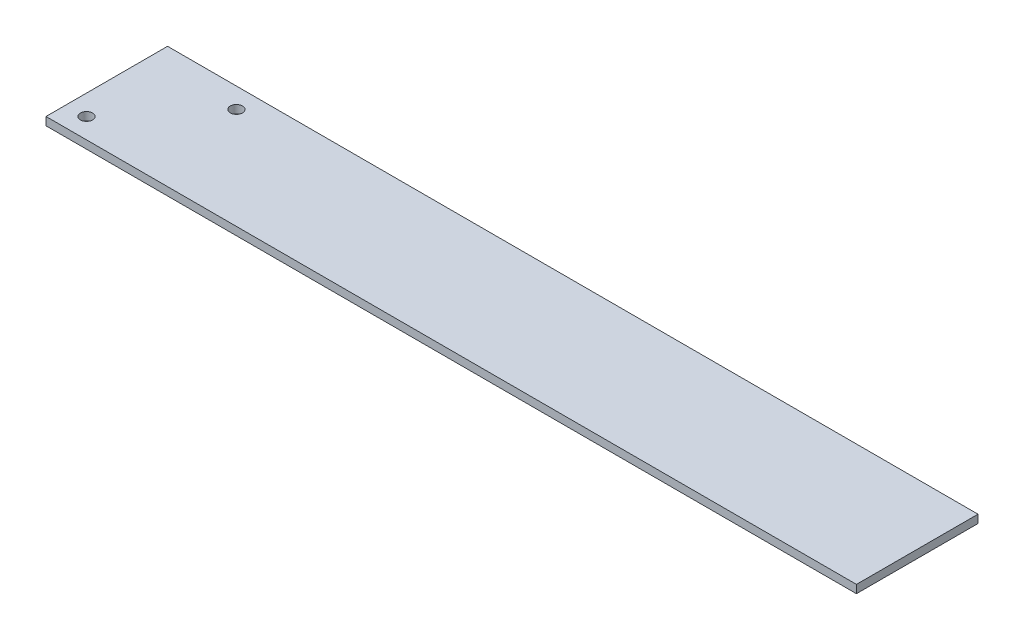
ISO-10303-21;
HEADER;
FILE_DESCRIPTION(('STEP AP214'),'2;1');
FILE_NAME('part.step','',(''),(''),'','','');
FILE_SCHEMA(('AUTOMOTIVE_DESIGN { 1 0 10303 214 1 1 1 1 }'));
ENDSEC;
DATA;
#1=APPLICATION_CONTEXT('core data for automotive mechanical design processes');
#2=APPLICATION_PROTOCOL_DEFINITION('international standard','automotive_design',2000,#1);
#3=PRODUCT_CONTEXT('',#1,'mechanical');
#4=PRODUCT('Part','Part','',(#3));
#5=PRODUCT_RELATED_PRODUCT_CATEGORY('part','',(#4));
#6=PRODUCT_DEFINITION_FORMATION('','',#4);
#7=PRODUCT_DEFINITION_CONTEXT('part definition',#1,'design');
#8=PRODUCT_DEFINITION('design','',#6,#7);
#9=PRODUCT_DEFINITION_SHAPE('','',#8);
#10=(LENGTH_UNIT() NAMED_UNIT(*) SI_UNIT(.MILLI.,.METRE.));
#11=(NAMED_UNIT(*) PLANE_ANGLE_UNIT() SI_UNIT($,.RADIAN.));
#12=(NAMED_UNIT(*) SI_UNIT($,.STERADIAN.) SOLID_ANGLE_UNIT());
#13=UNCERTAINTY_MEASURE_WITH_UNIT(LENGTH_MEASURE(1.E-05),#10,'distance_accuracy_value','');
#14=(GEOMETRIC_REPRESENTATION_CONTEXT(3) GLOBAL_UNCERTAINTY_ASSIGNED_CONTEXT((#13)) GLOBAL_UNIT_ASSIGNED_CONTEXT((#10,
#11,#12)) REPRESENTATION_CONTEXT('',''));
#15=CARTESIAN_POINT('',(0.,0.,0.));
#16=DIRECTION('',(0.,0.,1.));
#17=DIRECTION('',(1.,0.,0.));
#18=AXIS2_PLACEMENT_3D('',#15,#16,#17);
#19=CARTESIAN_POINT('',(0.,2.,0.));
#20=DIRECTION('',(0.,1.,0.));
#21=DIRECTION('',(0.,0.,1.));
#22=AXIS2_PLACEMENT_3D('',#19,#20,#21);
#23=PLANE('',#22);
#24=CARTESIAN_POINT('',(-95.0000000000001,2.,10.));
#25=DIRECTION('',(0.,1.,0.));
#26=DIRECTION('',(0.,0.,1.));
#27=AXIS2_PLACEMENT_3D('',#24,#25,#26);
#28=CIRCLE('',#27,1.5);
#29=CARTESIAN_POINT('',(-95.0000000000001,2.,11.5));
#30=VERTEX_POINT('',#29);
#31=EDGE_CURVE('E100',#30,#30,#28,.T.);
#32=ORIENTED_EDGE('',*,*,#31,.F.);
#33=EDGE_LOOP('',(#32));
#34=FACE_BOUND('',#33,.T.);
#35=DIRECTION('',(0.,0.,-1.));
#36=VECTOR('',#35,1.);
#37=CARTESIAN_POINT('',(100.,2.,-15.));
#38=LINE('',#37,#36);
#39=CARTESIAN_POINT('',(100.,2.,15.));
#40=VERTEX_POINT('',#39);
#41=CARTESIAN_POINT('',(100.,2.,-15.));
#42=VERTEX_POINT('',#41);
#43=EDGE_CURVE('E85',#40,#42,#38,.T.);
#44=ORIENTED_EDGE('',*,*,#43,.T.);
#45=DIRECTION('',(-1.,0.,0.));
#46=VECTOR('',#45,1.);
#47=CARTESIAN_POINT('',(-100.,2.,-15.));
#48=LINE('',#47,#46);
#49=CARTESIAN_POINT('',(-100.,2.,-15.));
#50=VERTEX_POINT('',#49);
#51=EDGE_CURVE('E80',#42,#50,#48,.T.);
#52=ORIENTED_EDGE('',*,*,#51,.T.);
#53=DIRECTION('',(0.,0.,1.));
#54=VECTOR('',#53,1.);
#55=CARTESIAN_POINT('',(-100.,2.,-15.));
#56=LINE('',#55,#54);
#57=CARTESIAN_POINT('',(-100.,2.,15.));
#58=VERTEX_POINT('',#57);
#59=EDGE_CURVE('E83',#50,#58,#56,.T.);
#60=ORIENTED_EDGE('',*,*,#59,.T.);
#61=DIRECTION('',(1.,0.,0.));
#62=VECTOR('',#61,1.);
#63=CARTESIAN_POINT('',(-100.,2.,15.));
#64=LINE('',#63,#62);
#65=EDGE_CURVE('E50',#58,#40,#64,.T.);
#66=ORIENTED_EDGE('',*,*,#65,.T.);
#67=EDGE_LOOP('',(#44,#52,#60,#66));
#68=FACE_BOUND('',#67,.T.);
#69=CARTESIAN_POINT('',(-78.,2.,-10.));
#70=DIRECTION('',(0.,1.,0.));
#71=DIRECTION('',(0.,0.,1.));
#72=AXIS2_PLACEMENT_3D('',#69,#70,#71);
#73=CIRCLE('',#72,1.5);
#74=CARTESIAN_POINT('',(-78.,2.,-8.5));
#75=VERTEX_POINT('',#74);
#76=EDGE_CURVE('E115',#75,#75,#73,.T.);
#77=ORIENTED_EDGE('',*,*,#76,.F.);
#78=EDGE_LOOP('',(#77));
#79=FACE_BOUND('',#78,.T.);
#80=ADVANCED_FACE('F33',(#34,#68,#79),#23,.T.);
#81=CARTESIAN_POINT('',(0.,0.,0.));
#82=DIRECTION('',(0.,1.,0.));
#83=DIRECTION('',(0.,0.,1.));
#84=AXIS2_PLACEMENT_3D('',#81,#82,#83);
#85=PLANE('',#84);
#86=DIRECTION('',(0.,0.,-1.));
#87=VECTOR('',#86,1.);
#88=CARTESIAN_POINT('',(100.,0.,-15.));
#89=LINE('',#88,#87);
#90=CARTESIAN_POINT('',(100.,0.,15.));
#91=VERTEX_POINT('',#90);
#92=CARTESIAN_POINT('',(100.,0.,-15.));
#93=VERTEX_POINT('',#92);
#94=EDGE_CURVE('E97',#91,#93,#89,.T.);
#95=ORIENTED_EDGE('',*,*,#94,.F.);
#96=DIRECTION('',(1.,0.,0.));
#97=VECTOR('',#96,1.);
#98=CARTESIAN_POINT('',(-100.,0.,15.));
#99=LINE('',#98,#97);
#100=CARTESIAN_POINT('',(-100.,0.,15.));
#101=VERTEX_POINT('',#100);
#102=EDGE_CURVE('E73',#101,#91,#99,.T.);
#103=ORIENTED_EDGE('',*,*,#102,.F.);
#104=DIRECTION('',(0.,0.,1.));
#105=VECTOR('',#104,1.);
#106=CARTESIAN_POINT('',(-100.,0.,-15.));
#107=LINE('',#106,#105);
#108=CARTESIAN_POINT('',(-100.,0.,-15.));
#109=VERTEX_POINT('',#108);
#110=EDGE_CURVE('E67',#109,#101,#107,.T.);
#111=ORIENTED_EDGE('',*,*,#110,.F.);
#112=DIRECTION('',(-1.,0.,0.));
#113=VECTOR('',#112,1.);
#114=CARTESIAN_POINT('',(-100.,0.,-15.));
#115=LINE('',#114,#113);
#116=EDGE_CURVE('E89',#93,#109,#115,.T.);
#117=ORIENTED_EDGE('',*,*,#116,.F.);
#118=EDGE_LOOP('',(#95,#103,#111,#117));
#119=FACE_BOUND('',#118,.T.);
#120=CARTESIAN_POINT('',(-95.0000000000001,0.,10.));
#121=DIRECTION('',(0.,1.,0.));
#122=DIRECTION('',(0.,0.,1.));
#123=AXIS2_PLACEMENT_3D('',#120,#121,#122);
#124=CIRCLE('',#123,1.5);
#125=CARTESIAN_POINT('',(-95.0000000000001,0.,11.5));
#126=VERTEX_POINT('',#125);
#127=EDGE_CURVE('E112',#126,#126,#124,.T.);
#128=ORIENTED_EDGE('',*,*,#127,.T.);
#129=EDGE_LOOP('',(#128));
#130=FACE_BOUND('',#129,.T.);
#131=CARTESIAN_POINT('',(-78.,0.,-10.));
#132=DIRECTION('',(0.,1.,0.));
#133=DIRECTION('',(0.,0.,1.));
#134=AXIS2_PLACEMENT_3D('',#131,#132,#133);
#135=CIRCLE('',#134,1.5);
#136=CARTESIAN_POINT('',(-78.,0.,-8.5));
#137=VERTEX_POINT('',#136);
#138=EDGE_CURVE('E118',#137,#137,#135,.T.);
#139=ORIENTED_EDGE('',*,*,#138,.T.);
#140=EDGE_LOOP('',(#139));
#141=FACE_BOUND('',#140,.T.);
#142=ADVANCED_FACE('F108',(#119,#130,#141),#85,.F.);
#143=CARTESIAN_POINT('',(100.,2.,-15.));
#144=DIRECTION('',(-1.,0.,0.));
#145=DIRECTION('',(0.,0.,1.));
#146=AXIS2_PLACEMENT_3D('',#143,#144,#145);
#147=PLANE('',#146);
#148=ORIENTED_EDGE('',*,*,#94,.T.);
#149=DIRECTION('',(0.,-1.,0.));
#150=VECTOR('',#149,1.);
#151=CARTESIAN_POINT('',(100.,2.,-15.));
#152=LINE('',#151,#150);
#153=EDGE_CURVE('E11',#42,#93,#152,.T.);
#154=ORIENTED_EDGE('',*,*,#153,.F.);
#155=ORIENTED_EDGE('',*,*,#43,.F.);
#156=DIRECTION('',(0.,-1.,0.));
#157=VECTOR('',#156,1.);
#158=CARTESIAN_POINT('',(100.,2.,15.));
#159=LINE('',#158,#157);
#160=EDGE_CURVE('E93',#40,#91,#159,.T.);
#161=ORIENTED_EDGE('',*,*,#160,.T.);
#162=EDGE_LOOP('',(#148,#154,#155,#161));
#163=FACE_BOUND('',#162,.T.);
#164=ADVANCED_FACE('F35',(#163),#147,.F.);
#165=CARTESIAN_POINT('',(-100.,2.,-15.));
#166=DIRECTION('',(0.,0.,1.));
#167=DIRECTION('',(1.,0.,0.));
#168=AXIS2_PLACEMENT_3D('',#165,#166,#167);
#169=PLANE('',#168);
#170=ORIENTED_EDGE('',*,*,#116,.T.);
#171=DIRECTION('',(0.,-1.,0.));
#172=VECTOR('',#171,1.);
#173=CARTESIAN_POINT('',(-100.,2.,-15.));
#174=LINE('',#173,#172);
#175=EDGE_CURVE('E42',#50,#109,#174,.T.);
#176=ORIENTED_EDGE('',*,*,#175,.F.);
#177=ORIENTED_EDGE('',*,*,#51,.F.);
#178=ORIENTED_EDGE('',*,*,#153,.T.);
#179=EDGE_LOOP('',(#170,#176,#177,#178));
#180=FACE_BOUND('',#179,.T.);
#181=ADVANCED_FACE('F88',(#180),#169,.F.);
#182=CARTESIAN_POINT('',(-100.,2.,-15.));
#183=DIRECTION('',(1.,0.,0.));
#184=DIRECTION('',(0.,0.,-1.));
#185=AXIS2_PLACEMENT_3D('',#182,#183,#184);
#186=PLANE('',#185);
#187=ORIENTED_EDGE('',*,*,#110,.T.);
#188=DIRECTION('',(0.,-1.,0.));
#189=VECTOR('',#188,1.);
#190=CARTESIAN_POINT('',(-100.,2.,15.));
#191=LINE('',#190,#189);
#192=EDGE_CURVE('E90',#58,#101,#191,.T.);
#193=ORIENTED_EDGE('',*,*,#192,.F.);
#194=ORIENTED_EDGE('',*,*,#59,.F.);
#195=ORIENTED_EDGE('',*,*,#175,.T.);
#196=EDGE_LOOP('',(#187,#193,#194,#195));
#197=FACE_BOUND('',#196,.T.);
#198=ADVANCED_FACE('F91',(#197),#186,.F.);
#199=CARTESIAN_POINT('',(-100.,2.,15.));
#200=DIRECTION('',(0.,0.,-1.));
#201=DIRECTION('',(-1.,0.,0.));
#202=AXIS2_PLACEMENT_3D('',#199,#200,#201);
#203=PLANE('',#202);
#204=ORIENTED_EDGE('',*,*,#102,.T.);
#205=ORIENTED_EDGE('',*,*,#160,.F.);
#206=ORIENTED_EDGE('',*,*,#65,.F.);
#207=ORIENTED_EDGE('',*,*,#192,.T.);
#208=EDGE_LOOP('',(#204,#205,#206,#207));
#209=FACE_BOUND('',#208,.T.);
#210=ADVANCED_FACE('F105',(#209),#203,.F.);
#211=CARTESIAN_POINT('',(-95.0000000000001,2.,10.));
#212=DIRECTION('',(0.,-1.,0.));
#213=DIRECTION('',(0.,0.,-1.));
#214=AXIS2_PLACEMENT_3D('',#211,#212,#213);
#215=CYLINDRICAL_SURFACE('',#214,1.5);
#216=ORIENTED_EDGE('',*,*,#31,.T.);
#217=EDGE_LOOP('',(#216));
#218=FACE_BOUND('',#217,.T.);
#219=ORIENTED_EDGE('',*,*,#127,.F.);
#220=EDGE_LOOP('',(#219));
#221=FACE_BOUND('',#220,.T.);
#222=ADVANCED_FACE('F135',(#218,#221),#215,.F.);
#223=CARTESIAN_POINT('',(-78.,2.,-10.));
#224=DIRECTION('',(0.,-1.,0.));
#225=DIRECTION('',(0.,0.,-1.));
#226=AXIS2_PLACEMENT_3D('',#223,#224,#225);
#227=CYLINDRICAL_SURFACE('',#226,1.5);
#228=ORIENTED_EDGE('',*,*,#76,.T.);
#229=EDGE_LOOP('',(#228));
#230=FACE_BOUND('',#229,.T.);
#231=ORIENTED_EDGE('',*,*,#138,.F.);
#232=EDGE_LOOP('',(#231));
#233=FACE_BOUND('',#232,.T.);
#234=ADVANCED_FACE('F124',(#230,#233),#227,.F.);
#235=CLOSED_SHELL('',(#80,#142,#164,#181,#198,#210,#222,#234));
#236=MANIFOLD_SOLID_BREP('B2',#235);
#237=ADVANCED_BREP_SHAPE_REPRESENTATION('',(#18,#236),#14);
#238=SHAPE_DEFINITION_REPRESENTATION(#9,#237);
ENDSEC;
END-ISO-10303-21;
